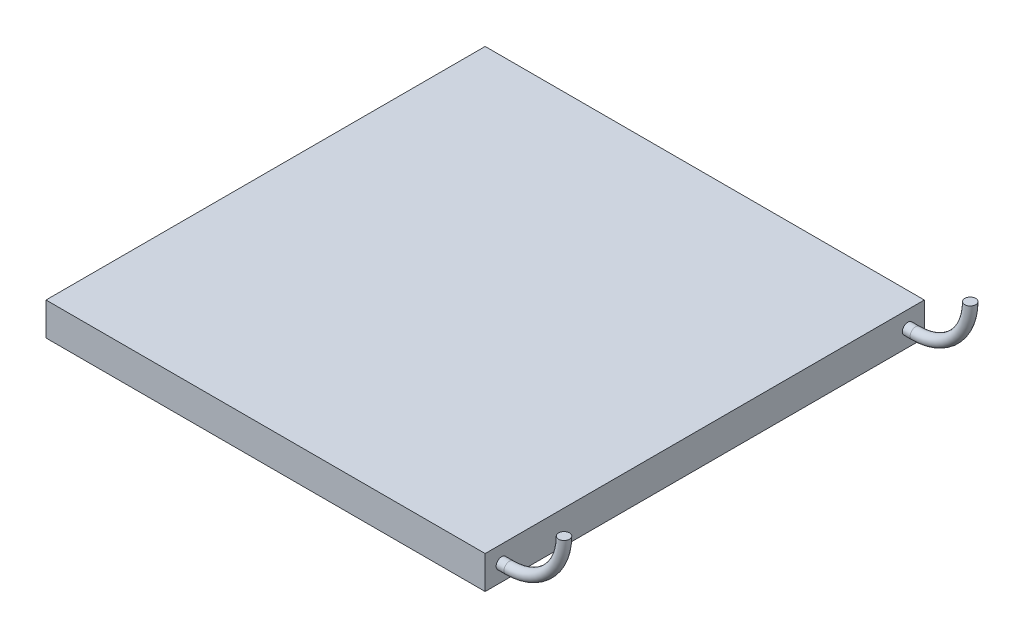
ISO-10303-21;
HEADER;
FILE_DESCRIPTION(('STEP AP214'),'2;1');
FILE_NAME('part.step','',(''),(''),'','','');
FILE_SCHEMA(('AUTOMOTIVE_DESIGN { 1 0 10303 214 1 1 1 1 }'));
ENDSEC;
DATA;
#1=APPLICATION_CONTEXT('core data for automotive mechanical design processes');
#2=APPLICATION_PROTOCOL_DEFINITION('international standard','automotive_design',2000,#1);
#3=PRODUCT_CONTEXT('',#1,'mechanical');
#4=PRODUCT('Part','Part','',(#3));
#5=PRODUCT_RELATED_PRODUCT_CATEGORY('part','',(#4));
#6=PRODUCT_DEFINITION_FORMATION('','',#4);
#7=PRODUCT_DEFINITION_CONTEXT('part definition',#1,'design');
#8=PRODUCT_DEFINITION('design','',#6,#7);
#9=PRODUCT_DEFINITION_SHAPE('','',#8);
#10=(LENGTH_UNIT() NAMED_UNIT(*) SI_UNIT(.MILLI.,.METRE.));
#11=(NAMED_UNIT(*) PLANE_ANGLE_UNIT() SI_UNIT($,.RADIAN.));
#12=(NAMED_UNIT(*) SI_UNIT($,.STERADIAN.) SOLID_ANGLE_UNIT());
#13=UNCERTAINTY_MEASURE_WITH_UNIT(LENGTH_MEASURE(1.E-05),#10,'distance_accuracy_value','');
#14=(GEOMETRIC_REPRESENTATION_CONTEXT(3) GLOBAL_UNCERTAINTY_ASSIGNED_CONTEXT((#13)) GLOBAL_UNIT_ASSIGNED_CONTEXT((#10,
#11,#12)) REPRESENTATION_CONTEXT('',''));
#15=CARTESIAN_POINT('',(0.,0.,0.));
#16=DIRECTION('',(0.,0.,1.));
#17=DIRECTION('',(1.,0.,0.));
#18=AXIS2_PLACEMENT_3D('',#15,#16,#17);
#19=CARTESIAN_POINT('',(20.,3.,20.));
#20=DIRECTION('',(-1.,0.,0.));
#21=DIRECTION('',(0.,0.,1.));
#22=AXIS2_PLACEMENT_3D('',#19,#20,#21);
#23=PLANE('',#22);
#24=CARTESIAN_POINT('',(20.,1.5,-18.5));
#25=DIRECTION('',(-1.,0.,0.));
#26=DIRECTION('',(0.,0.,1.));
#27=AXIS2_PLACEMENT_3D('',#24,#25,#26);
#28=CIRCLE('',#27,0.499999999999999);
#29=CARTESIAN_POINT('',(20.,1.5,-18.));
#30=VERTEX_POINT('',#29);
#31=EDGE_CURVE('E148',#30,#30,#28,.F.);
#32=ORIENTED_EDGE('',*,*,#31,.F.);
#33=EDGE_LOOP('',(#32));
#34=FACE_BOUND('',#33,.T.);
#35=CARTESIAN_POINT('',(20.,1.5,18.5));
#36=DIRECTION('',(1.,0.,0.));
#37=DIRECTION('',(0.,0.,-1.));
#38=AXIS2_PLACEMENT_3D('',#35,#36,#37);
#39=CIRCLE('',#38,0.499999999999999);
#40=CARTESIAN_POINT('',(20.,1.5,18.));
#41=VERTEX_POINT('',#40);
#42=EDGE_CURVE('E11',#41,#41,#39,.T.);
#43=ORIENTED_EDGE('',*,*,#42,.F.);
#44=EDGE_LOOP('',(#43));
#45=FACE_BOUND('',#44,.T.);
#46=DIRECTION('',(0.,0.,-1.));
#47=VECTOR('',#46,1.);
#48=CARTESIAN_POINT('',(20.,0.,20.));
#49=LINE('',#48,#47);
#50=CARTESIAN_POINT('',(20.,0.,20.));
#51=VERTEX_POINT('',#50);
#52=CARTESIAN_POINT('',(20.,0.,-20.));
#53=VERTEX_POINT('',#52);
#54=EDGE_CURVE('E112',#51,#53,#49,.T.);
#55=ORIENTED_EDGE('',*,*,#54,.T.);
#56=DIRECTION('',(0.,-1.,0.));
#57=VECTOR('',#56,1.);
#58=CARTESIAN_POINT('',(20.,3.,-20.));
#59=LINE('',#58,#57);
#60=CARTESIAN_POINT('',(20.,3.,-20.));
#61=VERTEX_POINT('',#60);
#62=EDGE_CURVE('E44',#61,#53,#59,.T.);
#63=ORIENTED_EDGE('',*,*,#62,.F.);
#64=DIRECTION('',(0.,0.,-1.));
#65=VECTOR('',#64,1.);
#66=CARTESIAN_POINT('',(20.,3.,20.));
#67=LINE('',#66,#65);
#68=CARTESIAN_POINT('',(20.,3.,20.));
#69=VERTEX_POINT('',#68);
#70=EDGE_CURVE('E95',#69,#61,#67,.T.);
#71=ORIENTED_EDGE('',*,*,#70,.F.);
#72=DIRECTION('',(0.,-1.,0.));
#73=VECTOR('',#72,1.);
#74=CARTESIAN_POINT('',(20.,3.,20.));
#75=LINE('',#74,#73);
#76=EDGE_CURVE('E108',#69,#51,#75,.T.);
#77=ORIENTED_EDGE('',*,*,#76,.T.);
#78=EDGE_LOOP('',(#55,#63,#71,#77));
#79=FACE_BOUND('',#78,.T.);
#80=ADVANCED_FACE('F41',(#34,#45,#79),#23,.F.);
#81=CARTESIAN_POINT('',(-20.,3.,-20.));
#82=DIRECTION('',(0.,0.,1.));
#83=DIRECTION('',(1.,0.,0.));
#84=AXIS2_PLACEMENT_3D('',#81,#82,#83);
#85=PLANE('',#84);
#86=DIRECTION('',(-1.,0.,0.));
#87=VECTOR('',#86,1.);
#88=CARTESIAN_POINT('',(-20.,0.,-20.));
#89=LINE('',#88,#87);
#90=CARTESIAN_POINT('',(-20.,0.,-20.));
#91=VERTEX_POINT('',#90);
#92=EDGE_CURVE('E101',#53,#91,#89,.T.);
#93=ORIENTED_EDGE('',*,*,#92,.T.);
#94=DIRECTION('',(0.,-1.,0.));
#95=VECTOR('',#94,1.);
#96=CARTESIAN_POINT('',(-20.,3.,-20.));
#97=LINE('',#96,#95);
#98=CARTESIAN_POINT('',(-20.,3.,-20.));
#99=VERTEX_POINT('',#98);
#100=EDGE_CURVE('E99',#99,#91,#97,.T.);
#101=ORIENTED_EDGE('',*,*,#100,.F.);
#102=DIRECTION('',(-1.,0.,0.));
#103=VECTOR('',#102,1.);
#104=CARTESIAN_POINT('',(-20.,3.,-20.));
#105=LINE('',#104,#103);
#106=EDGE_CURVE('E90',#61,#99,#105,.T.);
#107=ORIENTED_EDGE('',*,*,#106,.F.);
#108=ORIENTED_EDGE('',*,*,#62,.T.);
#109=EDGE_LOOP('',(#93,#101,#107,#108));
#110=FACE_BOUND('',#109,.T.);
#111=ADVANCED_FACE('F100',(#110),#85,.F.);
#112=CARTESIAN_POINT('',(-20.,3.,20.));
#113=DIRECTION('',(1.,0.,0.));
#114=DIRECTION('',(0.,0.,-1.));
#115=AXIS2_PLACEMENT_3D('',#112,#113,#114);
#116=PLANE('',#115);
#117=DIRECTION('',(0.,0.,1.));
#118=VECTOR('',#117,1.);
#119=CARTESIAN_POINT('',(-20.,0.,20.));
#120=LINE('',#119,#118);
#121=CARTESIAN_POINT('',(-20.,0.,20.));
#122=VERTEX_POINT('',#121);
#123=EDGE_CURVE('E76',#91,#122,#120,.T.);
#124=ORIENTED_EDGE('',*,*,#123,.T.);
#125=DIRECTION('',(0.,-1.,0.));
#126=VECTOR('',#125,1.);
#127=CARTESIAN_POINT('',(-20.,3.,20.));
#128=LINE('',#127,#126);
#129=CARTESIAN_POINT('',(-20.,3.,20.));
#130=VERTEX_POINT('',#129);
#131=EDGE_CURVE('E103',#130,#122,#128,.T.);
#132=ORIENTED_EDGE('',*,*,#131,.F.);
#133=DIRECTION('',(0.,0.,1.));
#134=VECTOR('',#133,1.);
#135=CARTESIAN_POINT('',(-20.,3.,20.));
#136=LINE('',#135,#134);
#137=EDGE_CURVE('E93',#99,#130,#136,.T.);
#138=ORIENTED_EDGE('',*,*,#137,.F.);
#139=ORIENTED_EDGE('',*,*,#100,.T.);
#140=EDGE_LOOP('',(#124,#132,#138,#139));
#141=FACE_BOUND('',#140,.T.);
#142=ADVANCED_FACE('F104',(#141),#116,.F.);
#143=CARTESIAN_POINT('',(-20.,3.,20.));
#144=DIRECTION('',(0.,0.,-1.));
#145=DIRECTION('',(-1.,0.,0.));
#146=AXIS2_PLACEMENT_3D('',#143,#144,#145);
#147=PLANE('',#146);
#148=DIRECTION('',(1.,0.,0.));
#149=VECTOR('',#148,1.);
#150=CARTESIAN_POINT('',(-20.,0.,20.));
#151=LINE('',#150,#149);
#152=EDGE_CURVE('E82',#122,#51,#151,.T.);
#153=ORIENTED_EDGE('',*,*,#152,.T.);
#154=ORIENTED_EDGE('',*,*,#76,.F.);
#155=DIRECTION('',(1.,0.,0.));
#156=VECTOR('',#155,1.);
#157=CARTESIAN_POINT('',(-20.,3.,20.));
#158=LINE('',#157,#156);
#159=EDGE_CURVE('E59',#130,#69,#158,.T.);
#160=ORIENTED_EDGE('',*,*,#159,.F.);
#161=ORIENTED_EDGE('',*,*,#131,.T.);
#162=EDGE_LOOP('',(#153,#154,#160,#161));
#163=FACE_BOUND('',#162,.T.);
#164=ADVANCED_FACE('F126',(#163),#147,.F.);
#165=CARTESIAN_POINT('',(0.,3.,0.));
#166=DIRECTION('',(0.,-1.,0.));
#167=DIRECTION('',(0.,0.,-1.));
#168=AXIS2_PLACEMENT_3D('',#165,#166,#167);
#169=PLANE('',#168);
#170=ORIENTED_EDGE('',*,*,#70,.T.);
#171=ORIENTED_EDGE('',*,*,#106,.T.);
#172=ORIENTED_EDGE('',*,*,#137,.T.);
#173=ORIENTED_EDGE('',*,*,#159,.T.);
#174=EDGE_LOOP('',(#170,#171,#172,#173));
#175=FACE_BOUND('',#174,.T.);
#176=ADVANCED_FACE('F91',(#175),#169,.F.);
#177=CARTESIAN_POINT('',(0.,0.,0.));
#178=DIRECTION('',(0.,-1.,0.));
#179=DIRECTION('',(0.,0.,-1.));
#180=AXIS2_PLACEMENT_3D('',#177,#178,#179);
#181=PLANE('',#180);
#182=ORIENTED_EDGE('',*,*,#54,.F.);
#183=ORIENTED_EDGE('',*,*,#152,.F.);
#184=ORIENTED_EDGE('',*,*,#123,.F.);
#185=ORIENTED_EDGE('',*,*,#92,.F.);
#186=EDGE_LOOP('',(#182,#183,#184,#185));
#187=FACE_BOUND('',#186,.T.);
#188=ADVANCED_FACE('F129',(#187),#181,.T.);
#189=CARTESIAN_POINT('',(25.681528761897,6.47051381013949,18.5));
#190=DIRECTION('',(0.,1.,0.));
#191=DIRECTION('',(0.,0.,-1.));
#192=AXIS2_PLACEMENT_3D('',#189,#190,#191);
#193=PLANE('',#192);
#194=CARTESIAN_POINT('',(25.681528761897,6.47051381013949,18.5));
#195=DIRECTION('',(0.,1.,0.));
#196=DIRECTION('',(0.,0.,-1.));
#197=AXIS2_PLACEMENT_3D('',#194,#195,#196);
#198=CIRCLE('',#197,0.499999999999999);
#199=CARTESIAN_POINT('',(26.181528761897,6.47051381013949,18.5));
#200=VERTEX_POINT('',#199);
#201=EDGE_CURVE('E116',#200,#200,#198,.T.);
#202=ORIENTED_EDGE('',*,*,#201,.T.);
#203=EDGE_LOOP('',(#202));
#204=FACE_BOUND('',#203,.T.);
#205=ADVANCED_FACE('F162',(#204),#193,.T.);
#206=CARTESIAN_POINT('',(20.,1.5,18.5));
#207=DIRECTION('',(1.,0.,0.));
#208=DIRECTION('',(0.,0.,-1.));
#209=AXIS2_PLACEMENT_3D('',#206,#207,#208);
#210=CYLINDRICAL_SURFACE('',#209,0.499999999999999);
#211=CARTESIAN_POINT('',(20.7110149517575,1.5,18.5));
#212=DIRECTION('',(1.,0.,0.));
#213=DIRECTION('',(0.,0.,-1.));
#214=AXIS2_PLACEMENT_3D('',#211,#212,#213);
#215=CIRCLE('',#214,0.499999999999999);
#216=CARTESIAN_POINT('',(20.7110149517575,1.,18.5));
#217=VERTEX_POINT('',#216);
#218=EDGE_CURVE('E136',#217,#217,#215,.T.);
#219=ORIENTED_EDGE('',*,*,#218,.F.);
#220=EDGE_LOOP('',(#219));
#221=FACE_BOUND('',#220,.T.);
#222=ORIENTED_EDGE('',*,*,#42,.T.);
#223=EDGE_LOOP('',(#222));
#224=FACE_BOUND('',#223,.T.);
#225=ADVANCED_FACE('F159',(#221,#224),#210,.T.);
#226=CARTESIAN_POINT('',(20.7110149517575,6.47051381013949,18.5));
#227=DIRECTION('',(0.,0.,1.));
#228=DIRECTION('',(1.,0.,0.));
#229=AXIS2_PLACEMENT_3D('',#226,#227,#228);
#230=TOROIDAL_SURFACE('',#229,4.97051381013949,0.499999999999999);
#231=CARTESIAN_POINT('',(20.7110149517575,6.47051381013949,18.5));
#232=DIRECTION('',(0.,0.,1.));
#233=DIRECTION('',(1.,0.,0.));
#234=AXIS2_PLACEMENT_3D('',#231,#232,#233);
#235=CIRCLE('',#234,5.47051381013949);
#236=EDGE_CURVE('',#217,#200,#235,.T.);
#237=ORIENTED_EDGE('',*,*,#218,.T.);
#238=ORIENTED_EDGE('',*,*,#201,.F.);
#239=ORIENTED_EDGE('',*,*,#236,.T.);
#240=ORIENTED_EDGE('',*,*,#236,.F.);
#241=EDGE_LOOP('',(#237,#239,#238,#240));
#242=FACE_BOUND('',#241,.T.);
#243=ADVANCED_FACE('F161',(#242),#230,.T.);
#244=CARTESIAN_POINT('',(25.681528761897,6.47051381013949,-18.5));
#245=DIRECTION('',(0.,1.,0.));
#246=DIRECTION('',(0.,0.,1.));
#247=AXIS2_PLACEMENT_3D('',#244,#245,#246);
#248=PLANE('',#247);
#249=CARTESIAN_POINT('',(25.681528761897,6.47051381013949,-18.5));
#250=DIRECTION('',(0.,-1.,0.));
#251=DIRECTION('',(0.,0.,1.));
#252=AXIS2_PLACEMENT_3D('',#249,#250,#251);
#253=CIRCLE('',#252,0.499999999999999);
#254=CARTESIAN_POINT('',(26.181528761897,6.47051381013949,-18.5));
#255=VERTEX_POINT('',#254);
#256=EDGE_CURVE('E139',#255,#255,#253,.F.);
#257=ORIENTED_EDGE('',*,*,#256,.T.);
#258=EDGE_LOOP('',(#257));
#259=FACE_BOUND('',#258,.T.);
#260=ADVANCED_FACE('F169',(#259),#248,.T.);
#261=CARTESIAN_POINT('',(20.,1.5,-18.5));
#262=DIRECTION('',(1.,0.,0.));
#263=DIRECTION('',(0.,0.,-1.));
#264=AXIS2_PLACEMENT_3D('',#261,#262,#263);
#265=CYLINDRICAL_SURFACE('',#264,0.499999999999999);
#266=CARTESIAN_POINT('',(20.7110149517575,1.5,-18.5));
#267=DIRECTION('',(-1.,0.,0.));
#268=DIRECTION('',(0.,0.,1.));
#269=AXIS2_PLACEMENT_3D('',#266,#267,#268);
#270=CIRCLE('',#269,0.499999999999999);
#271=CARTESIAN_POINT('',(20.7110149517575,1.,-18.5));
#272=VERTEX_POINT('',#271);
#273=EDGE_CURVE('E144',#272,#272,#270,.F.);
#274=ORIENTED_EDGE('',*,*,#273,.F.);
#275=EDGE_LOOP('',(#274));
#276=FACE_BOUND('',#275,.T.);
#277=ORIENTED_EDGE('',*,*,#31,.T.);
#278=EDGE_LOOP('',(#277));
#279=FACE_BOUND('',#278,.T.);
#280=ADVANCED_FACE('F153',(#276,#279),#265,.T.);
#281=CARTESIAN_POINT('',(20.7110149517575,6.47051381013949,-18.5));
#282=DIRECTION('',(0.,0.,1.));
#283=DIRECTION('',(1.,0.,0.));
#284=AXIS2_PLACEMENT_3D('',#281,#282,#283);
#285=TOROIDAL_SURFACE('',#284,4.97051381013949,0.499999999999999);
#286=CARTESIAN_POINT('',(20.7110149517575,6.47051381013949,-18.5));
#287=DIRECTION('',(0.,0.,1.));
#288=DIRECTION('',(1.,0.,0.));
#289=AXIS2_PLACEMENT_3D('',#286,#287,#288);
#290=CIRCLE('',#289,5.47051381013949);
#291=EDGE_CURVE('',#272,#255,#290,.T.);
#292=ORIENTED_EDGE('',*,*,#273,.T.);
#293=ORIENTED_EDGE('',*,*,#256,.F.);
#294=ORIENTED_EDGE('',*,*,#291,.T.);
#295=ORIENTED_EDGE('',*,*,#291,.F.);
#296=EDGE_LOOP('',(#292,#294,#293,#295));
#297=FACE_BOUND('',#296,.T.);
#298=ADVANCED_FACE('F174',(#297),#285,.T.);
#299=CLOSED_SHELL('',(#80,#111,#142,#164,#176,#188,#205,#225,#243,#260,#280,#298));
#300=MANIFOLD_SOLID_BREP('B2',#299);
#301=ADVANCED_BREP_SHAPE_REPRESENTATION('',(#18,#300),#14);
#302=SHAPE_DEFINITION_REPRESENTATION(#9,#301);
ENDSEC;
END-ISO-10303-21;
